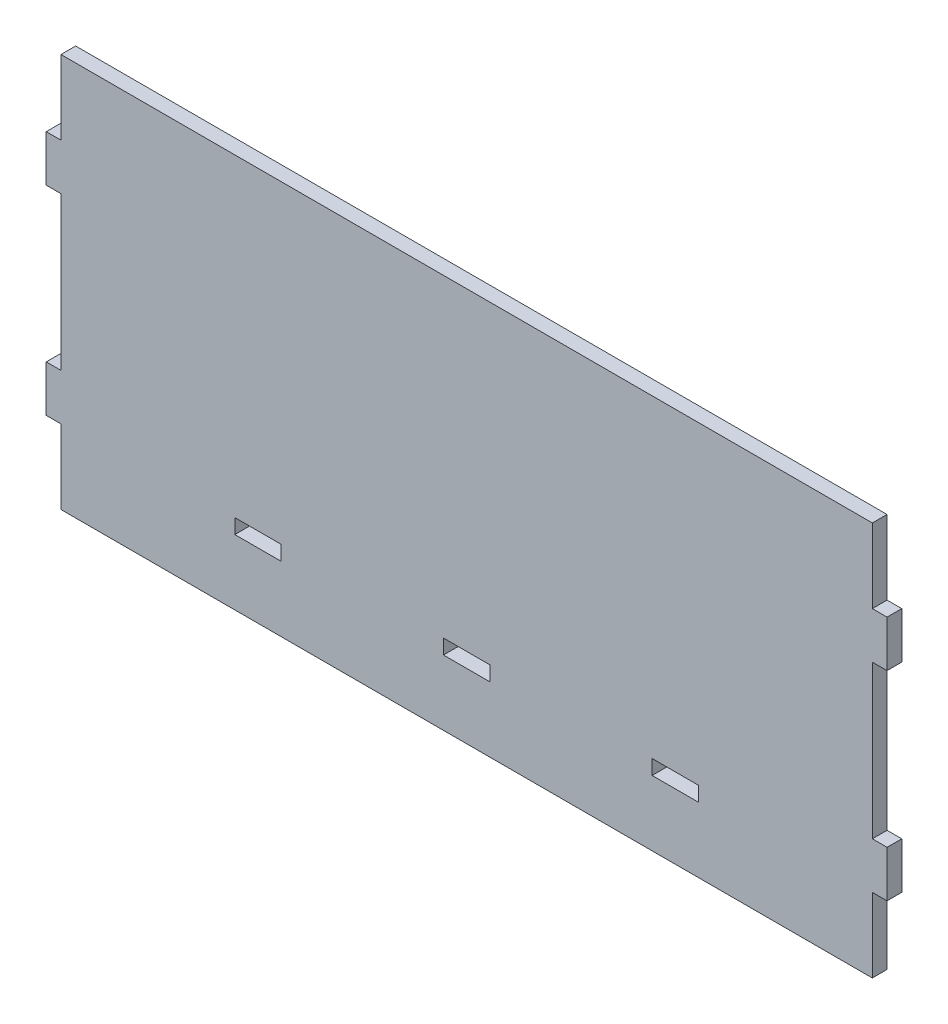
ISO-10303-21;
HEADER;
FILE_DESCRIPTION(('STEP AP214'),'2;1');
FILE_NAME('part.step','',(''),(''),'','','');
FILE_SCHEMA(('AUTOMOTIVE_DESIGN { 1 0 10303 214 1 1 1 1 }'));
ENDSEC;
DATA;
#1=APPLICATION_CONTEXT('core data for automotive mechanical design processes');
#2=APPLICATION_PROTOCOL_DEFINITION('international standard','automotive_design',2000,#1);
#3=PRODUCT_CONTEXT('',#1,'mechanical');
#4=PRODUCT('Part','Part','',(#3));
#5=PRODUCT_RELATED_PRODUCT_CATEGORY('part','',(#4));
#6=PRODUCT_DEFINITION_FORMATION('','',#4);
#7=PRODUCT_DEFINITION_CONTEXT('part definition',#1,'design');
#8=PRODUCT_DEFINITION('design','',#6,#7);
#9=PRODUCT_DEFINITION_SHAPE('','',#8);
#10=(LENGTH_UNIT() NAMED_UNIT(*) SI_UNIT(.MILLI.,.METRE.));
#11=(NAMED_UNIT(*) PLANE_ANGLE_UNIT() SI_UNIT($,.RADIAN.));
#12=(NAMED_UNIT(*) SI_UNIT($,.STERADIAN.) SOLID_ANGLE_UNIT());
#13=UNCERTAINTY_MEASURE_WITH_UNIT(LENGTH_MEASURE(1.E-05),#10,'distance_accuracy_value','');
#14=(GEOMETRIC_REPRESENTATION_CONTEXT(3) GLOBAL_UNCERTAINTY_ASSIGNED_CONTEXT((#13)) GLOBAL_UNIT_ASSIGNED_CONTEXT((#10,
#11,#12)) REPRESENTATION_CONTEXT('',''));
#15=CARTESIAN_POINT('',(0.,0.,0.));
#16=DIRECTION('',(0.,0.,1.));
#17=DIRECTION('',(1.,0.,0.));
#18=AXIS2_PLACEMENT_3D('',#15,#16,#17);
#19=CARTESIAN_POINT('',(193.650000026,150.,6.35));
#20=DIRECTION('',(-1.,0.,0.));
#21=DIRECTION('',(0.,0.,1.));
#22=AXIS2_PLACEMENT_3D('',#19,#20,#21);
#23=PLANE('',#22);
#24=DIRECTION('',(0.,1.,0.));
#25=VECTOR('',#24,1.);
#26=CARTESIAN_POINT('',(193.650000026,150.,6.35));
#27=LINE('',#26,#25);
#28=CARTESIAN_POINT('',(193.650000026,32.,6.35));
#29=VERTEX_POINT('',#28);
#30=CARTESIAN_POINT('',(193.650000026,98.,6.35));
#31=VERTEX_POINT('',#30);
#32=EDGE_CURVE('E439',#29,#31,#27,.T.);
#33=ORIENTED_EDGE('',*,*,#32,.F.);
#34=DIRECTION('',(0.,0.,-1.));
#35=VECTOR('',#34,1.);
#36=CARTESIAN_POINT('',(193.650000026,32.,0.));
#37=LINE('',#36,#35);
#38=CARTESIAN_POINT('',(193.650000026,32.,0.));
#39=VERTEX_POINT('',#38);
#40=EDGE_CURVE('E309',#29,#39,#37,.T.);
#41=ORIENTED_EDGE('',*,*,#40,.T.);
#42=DIRECTION('',(0.,1.,0.));
#43=VECTOR('',#42,1.);
#44=CARTESIAN_POINT('',(193.650000026,150.,0.));
#45=LINE('',#44,#43);
#46=CARTESIAN_POINT('',(193.650000026,98.,0.));
#47=VERTEX_POINT('',#46);
#48=EDGE_CURVE('E451',#39,#47,#45,.T.);
#49=ORIENTED_EDGE('',*,*,#48,.T.);
#50=DIRECTION('',(0.,0.,1.));
#51=VECTOR('',#50,1.);
#52=CARTESIAN_POINT('',(193.650000026,98.,0.));
#53=LINE('',#52,#51);
#54=EDGE_CURVE('E349',#47,#31,#53,.T.);
#55=ORIENTED_EDGE('',*,*,#54,.T.);
#56=EDGE_LOOP('',(#33,#41,#49,#55));
#57=FACE_BOUND('',#56,.T.);
#58=ADVANCED_FACE('F35',(#57),#23,.F.);
#59=CARTESIAN_POINT('',(193.650000026,-20.,0.));
#60=VERTEX_POINT('',#59);
#61=CARTESIAN_POINT('',(193.650000026,12.,0.));
#62=VERTEX_POINT('',#61);
#63=EDGE_CURVE('E448',#60,#62,#45,.T.);
#64=ORIENTED_EDGE('',*,*,#63,.T.);
#65=DIRECTION('',(0.,0.,1.));
#66=VECTOR('',#65,1.);
#67=CARTESIAN_POINT('',(193.650000026,12.,0.));
#68=LINE('',#67,#66);
#69=CARTESIAN_POINT('',(193.650000026,12.,6.35));
#70=VERTEX_POINT('',#69);
#71=EDGE_CURVE('E320',#62,#70,#68,.T.);
#72=ORIENTED_EDGE('',*,*,#71,.T.);
#73=CARTESIAN_POINT('',(193.650000026,-20.,6.35));
#74=VERTEX_POINT('',#73);
#75=EDGE_CURVE('E435',#74,#70,#27,.T.);
#76=ORIENTED_EDGE('',*,*,#75,.F.);
#77=DIRECTION('',(0.,0.,-1.));
#78=VECTOR('',#77,1.);
#79=CARTESIAN_POINT('',(193.650000026,-20.,6.35));
#80=LINE('',#79,#78);
#81=EDGE_CURVE('E458',#74,#60,#80,.T.);
#82=ORIENTED_EDGE('',*,*,#81,.T.);
#83=EDGE_LOOP('',(#64,#72,#76,#82));
#84=FACE_BOUND('',#83,.T.);
#85=ADVANCED_FACE('F519',(#84),#23,.F.);
#86=CARTESIAN_POINT('',(-156.349999974,150.,6.35));
#87=DIRECTION('',(1.,0.,0.));
#88=DIRECTION('',(0.,0.,-1.));
#89=AXIS2_PLACEMENT_3D('',#86,#87,#88);
#90=PLANE('',#89);
#91=DIRECTION('',(0.,0.,1.));
#92=VECTOR('',#91,1.);
#93=CARTESIAN_POINT('',(-156.349999974,12.,0.));
#94=LINE('',#93,#92);
#95=CARTESIAN_POINT('',(-156.349999974,12.,0.));
#96=VERTEX_POINT('',#95);
#97=CARTESIAN_POINT('',(-156.349999974,12.,6.35));
#98=VERTEX_POINT('',#97);
#99=EDGE_CURVE('E372',#96,#98,#94,.T.);
#100=ORIENTED_EDGE('',*,*,#99,.F.);
#101=DIRECTION('',(0.,-1.,0.));
#102=VECTOR('',#101,1.);
#103=CARTESIAN_POINT('',(-156.349999974,150.,0.));
#104=LINE('',#103,#102);
#105=CARTESIAN_POINT('',(-156.349999974,-20.,0.));
#106=VERTEX_POINT('',#105);
#107=EDGE_CURVE('E426',#96,#106,#104,.T.);
#108=ORIENTED_EDGE('',*,*,#107,.T.);
#109=DIRECTION('',(0.,0.,-1.));
#110=VECTOR('',#109,1.);
#111=CARTESIAN_POINT('',(-156.349999974,-20.,6.35));
#112=LINE('',#111,#110);
#113=CARTESIAN_POINT('',(-156.349999974,-20.,6.35));
#114=VERTEX_POINT('',#113);
#115=EDGE_CURVE('E461',#114,#106,#112,.T.);
#116=ORIENTED_EDGE('',*,*,#115,.F.);
#117=DIRECTION('',(0.,-1.,0.));
#118=VECTOR('',#117,1.);
#119=CARTESIAN_POINT('',(-156.349999974,150.,6.35));
#120=LINE('',#119,#118);
#121=EDGE_CURVE('E432',#98,#114,#120,.T.);
#122=ORIENTED_EDGE('',*,*,#121,.F.);
#123=EDGE_LOOP('',(#100,#108,#116,#122));
#124=FACE_BOUND('',#123,.T.);
#125=ADVANCED_FACE('F526',(#124),#90,.F.);
#126=DIRECTION('',(0.,0.,-1.));
#127=VECTOR('',#126,1.);
#128=CARTESIAN_POINT('',(-156.349999974,32.,0.));
#129=LINE('',#128,#127);
#130=CARTESIAN_POINT('',(-156.349999974,32.,6.35));
#131=VERTEX_POINT('',#130);
#132=CARTESIAN_POINT('',(-156.349999974,32.,0.));
#133=VERTEX_POINT('',#132);
#134=EDGE_CURVE('E377',#131,#133,#129,.T.);
#135=ORIENTED_EDGE('',*,*,#134,.F.);
#136=CARTESIAN_POINT('',(-156.349999974,98.,6.35));
#137=VERTEX_POINT('',#136);
#138=EDGE_CURVE('E431',#137,#131,#120,.T.);
#139=ORIENTED_EDGE('',*,*,#138,.F.);
#140=DIRECTION('',(0.,0.,1.));
#141=VECTOR('',#140,1.);
#142=CARTESIAN_POINT('',(-156.349999974,98.,0.));
#143=LINE('',#142,#141);
#144=CARTESIAN_POINT('',(-156.349999974,98.,0.));
#145=VERTEX_POINT('',#144);
#146=EDGE_CURVE('E399',#145,#137,#143,.T.);
#147=ORIENTED_EDGE('',*,*,#146,.F.);
#148=EDGE_CURVE('E445',#145,#133,#104,.T.);
#149=ORIENTED_EDGE('',*,*,#148,.T.);
#150=EDGE_LOOP('',(#135,#139,#147,#149));
#151=FACE_BOUND('',#150,.T.);
#152=ADVANCED_FACE('F741',(#151),#90,.F.);
#153=DIRECTION('',(0.,0.,-1.));
#154=VECTOR('',#153,1.);
#155=CARTESIAN_POINT('',(-156.349999974,118.,0.));
#156=LINE('',#155,#154);
#157=CARTESIAN_POINT('',(-156.349999974,118.,6.35));
#158=VERTEX_POINT('',#157);
#159=CARTESIAN_POINT('',(-156.349999974,118.,0.));
#160=VERTEX_POINT('',#159);
#161=EDGE_CURVE('E404',#158,#160,#156,.T.);
#162=ORIENTED_EDGE('',*,*,#161,.F.);
#163=CARTESIAN_POINT('',(-156.349999974,150.,6.35));
#164=VERTEX_POINT('',#163);
#165=EDGE_CURVE('E427',#164,#158,#120,.T.);
#166=ORIENTED_EDGE('',*,*,#165,.F.);
#167=DIRECTION('',(0.,0.,-1.));
#168=VECTOR('',#167,1.);
#169=CARTESIAN_POINT('',(-156.349999974,150.,6.35));
#170=LINE('',#169,#168);
#171=CARTESIAN_POINT('',(-156.349999974,150.,0.));
#172=VERTEX_POINT('',#171);
#173=EDGE_CURVE('E441',#164,#172,#170,.T.);
#174=ORIENTED_EDGE('',*,*,#173,.T.);
#175=EDGE_CURVE('E442',#172,#160,#104,.T.);
#176=ORIENTED_EDGE('',*,*,#175,.T.);
#177=EDGE_LOOP('',(#162,#166,#174,#176));
#178=FACE_BOUND('',#177,.T.);
#179=ADVANCED_FACE('F37',(#178),#90,.F.);
#180=CARTESIAN_POINT('',(-156.349999974,-20.,6.35));
#181=DIRECTION('',(0.,1.,0.));
#182=DIRECTION('',(-1.,0.,0.));
#183=AXIS2_PLACEMENT_3D('',#180,#181,#182);
#184=PLANE('',#183);
#185=DIRECTION('',(1.,0.,0.));
#186=VECTOR('',#185,1.);
#187=CARTESIAN_POINT('',(-156.349999974,-20.,0.));
#188=LINE('',#187,#186);
#189=EDGE_CURVE('E444',#106,#60,#188,.T.);
#190=ORIENTED_EDGE('',*,*,#189,.T.);
#191=ORIENTED_EDGE('',*,*,#81,.F.);
#192=DIRECTION('',(1.,0.,0.));
#193=VECTOR('',#192,1.);
#194=CARTESIAN_POINT('',(-156.349999974,-20.,6.35));
#195=LINE('',#194,#193);
#196=EDGE_CURVE('E430',#114,#74,#195,.T.);
#197=ORIENTED_EDGE('',*,*,#196,.F.);
#198=ORIENTED_EDGE('',*,*,#115,.T.);
#199=EDGE_LOOP('',(#190,#191,#197,#198));
#200=FACE_BOUND('',#199,.T.);
#201=ADVANCED_FACE('F531',(#200),#184,.F.);
#202=CARTESIAN_POINT('',(193.650000026,118.,6.35));
#203=VERTEX_POINT('',#202);
#204=CARTESIAN_POINT('',(193.650000026,150.,6.35));
#205=VERTEX_POINT('',#204);
#206=EDGE_CURVE('E434',#203,#205,#27,.T.);
#207=ORIENTED_EDGE('',*,*,#206,.F.);
#208=DIRECTION('',(0.,0.,-1.));
#209=VECTOR('',#208,1.);
#210=CARTESIAN_POINT('',(193.650000026,118.,0.));
#211=LINE('',#210,#209);
#212=CARTESIAN_POINT('',(193.650000026,118.,0.));
#213=VERTEX_POINT('',#212);
#214=EDGE_CURVE('E344',#203,#213,#211,.T.);
#215=ORIENTED_EDGE('',*,*,#214,.T.);
#216=CARTESIAN_POINT('',(193.650000026,150.,0.));
#217=VERTEX_POINT('',#216);
#218=EDGE_CURVE('E447',#213,#217,#45,.T.);
#219=ORIENTED_EDGE('',*,*,#218,.T.);
#220=DIRECTION('',(0.,0.,-1.));
#221=VECTOR('',#220,1.);
#222=CARTESIAN_POINT('',(193.650000026,150.,6.35));
#223=LINE('',#222,#221);
#224=EDGE_CURVE('E455',#205,#217,#223,.T.);
#225=ORIENTED_EDGE('',*,*,#224,.F.);
#226=EDGE_LOOP('',(#207,#215,#219,#225));
#227=FACE_BOUND('',#226,.T.);
#228=ADVANCED_FACE('F522',(#227),#23,.F.);
#229=CARTESIAN_POINT('',(-156.349999974,150.,6.35));
#230=DIRECTION('',(0.,-1.,0.));
#231=DIRECTION('',(0.,0.,-1.));
#232=AXIS2_PLACEMENT_3D('',#229,#230,#231);
#233=PLANE('',#232);
#234=DIRECTION('',(-1.,0.,0.));
#235=VECTOR('',#234,1.);
#236=CARTESIAN_POINT('',(-156.349999974,150.,0.));
#237=LINE('',#236,#235);
#238=EDGE_CURVE('E450',#217,#172,#237,.T.);
#239=ORIENTED_EDGE('',*,*,#238,.T.);
#240=ORIENTED_EDGE('',*,*,#173,.F.);
#241=DIRECTION('',(-1.,0.,0.));
#242=VECTOR('',#241,1.);
#243=CARTESIAN_POINT('',(-156.349999974,150.,6.35));
#244=LINE('',#243,#242);
#245=EDGE_CURVE('E438',#205,#164,#244,.T.);
#246=ORIENTED_EDGE('',*,*,#245,.F.);
#247=ORIENTED_EDGE('',*,*,#224,.T.);
#248=EDGE_LOOP('',(#239,#240,#246,#247));
#249=FACE_BOUND('',#248,.T.);
#250=ADVANCED_FACE('F530',(#249),#233,.F.);
#251=CARTESIAN_POINT('',(0.,0.,6.35));
#252=DIRECTION('',(0.,0.,1.));
#253=DIRECTION('',(1.,0.,0.));
#254=AXIS2_PLACEMENT_3D('',#251,#252,#253);
#255=PLANE('',#254);
#256=DIRECTION('',(0.,1.,0.));
#257=VECTOR('',#256,1.);
#258=CARTESIAN_POINT('',(-61.349999974,8.15999999999937,6.35));
#259=LINE('',#258,#257);
#260=CARTESIAN_POINT('',(-61.349999974,8.15999999999937,6.35));
#261=VERTEX_POINT('',#260);
#262=CARTESIAN_POINT('',(-61.349999974,14.5099999999994,6.35));
#263=VERTEX_POINT('',#262);
#264=EDGE_CURVE('E50',#261,#263,#259,.T.);
#265=ORIENTED_EDGE('',*,*,#264,.F.);
#266=DIRECTION('',(1.,0.,0.));
#267=VECTOR('',#266,1.);
#268=CARTESIAN_POINT('',(-61.349999974,8.15999999999937,6.35));
#269=LINE('',#268,#267);
#270=CARTESIAN_POINT('',(-81.3499999740001,8.15999999999937,6.35));
#271=VERTEX_POINT('',#270);
#272=EDGE_CURVE('E285',#271,#261,#269,.T.);
#273=ORIENTED_EDGE('',*,*,#272,.F.);
#274=DIRECTION('',(0.,-1.,0.));
#275=VECTOR('',#274,1.);
#276=CARTESIAN_POINT('',(-81.3499999740001,8.15999999999937,6.35));
#277=LINE('',#276,#275);
#278=CARTESIAN_POINT('',(-81.3499999740001,14.5099999999994,6.35));
#279=VERTEX_POINT('',#278);
#280=EDGE_CURVE('E282',#279,#271,#277,.T.);
#281=ORIENTED_EDGE('',*,*,#280,.F.);
#282=DIRECTION('',(-1.,0.,0.));
#283=VECTOR('',#282,1.);
#284=CARTESIAN_POINT('',(-61.349999974,14.5099999999994,6.35));
#285=LINE('',#284,#283);
#286=EDGE_CURVE('E279',#263,#279,#285,.T.);
#287=ORIENTED_EDGE('',*,*,#286,.F.);
#288=EDGE_LOOP('',(#265,#273,#281,#287));
#289=FACE_BOUND('',#288,.T.);
#290=DIRECTION('',(0.,1.,0.));
#291=VECTOR('',#290,1.);
#292=CARTESIAN_POINT('',(118.650000026,8.16,6.35));
#293=LINE('',#292,#291);
#294=CARTESIAN_POINT('',(118.650000026,8.16,6.35));
#295=VERTEX_POINT('',#294);
#296=CARTESIAN_POINT('',(118.650000026,14.51,6.35));
#297=VERTEX_POINT('',#296);
#298=EDGE_CURVE('E58',#295,#297,#293,.T.);
#299=ORIENTED_EDGE('',*,*,#298,.F.);
#300=DIRECTION('',(1.,0.,0.));
#301=VECTOR('',#300,1.);
#302=CARTESIAN_POINT('',(118.650000026,8.16,6.35));
#303=LINE('',#302,#301);
#304=CARTESIAN_POINT('',(98.6500000259999,8.16,6.35));
#305=VERTEX_POINT('',#304);
#306=EDGE_CURVE('E268',#305,#295,#303,.T.);
#307=ORIENTED_EDGE('',*,*,#306,.F.);
#308=DIRECTION('',(0.,-1.,0.));
#309=VECTOR('',#308,1.);
#310=CARTESIAN_POINT('',(98.6500000259999,8.16,6.35));
#311=LINE('',#310,#309);
#312=CARTESIAN_POINT('',(98.6500000259999,14.51,6.35));
#313=VERTEX_POINT('',#312);
#314=EDGE_CURVE('E251',#313,#305,#311,.T.);
#315=ORIENTED_EDGE('',*,*,#314,.F.);
#316=DIRECTION('',(-1.,0.,0.));
#317=VECTOR('',#316,1.);
#318=CARTESIAN_POINT('',(118.650000026,14.51,6.35));
#319=LINE('',#318,#317);
#320=EDGE_CURVE('E261',#297,#313,#319,.T.);
#321=ORIENTED_EDGE('',*,*,#320,.F.);
#322=EDGE_LOOP('',(#299,#307,#315,#321));
#323=FACE_BOUND('',#322,.T.);
#324=DIRECTION('',(0.,1.,0.));
#325=VECTOR('',#324,1.);
#326=CARTESIAN_POINT('',(28.650000026,8.16,6.35));
#327=LINE('',#326,#325);
#328=CARTESIAN_POINT('',(28.650000026,8.16,6.35));
#329=VERTEX_POINT('',#328);
#330=CARTESIAN_POINT('',(28.650000026,14.51,6.35));
#331=VERTEX_POINT('',#330);
#332=EDGE_CURVE('E275',#329,#331,#327,.T.);
#333=ORIENTED_EDGE('',*,*,#332,.F.);
#334=DIRECTION('',(1.,0.,0.));
#335=VECTOR('',#334,1.);
#336=CARTESIAN_POINT('',(28.650000026,8.16,6.35));
#337=LINE('',#336,#335);
#338=CARTESIAN_POINT('',(8.65000002599995,8.16,6.35));
#339=VERTEX_POINT('',#338);
#340=EDGE_CURVE('E303',#339,#329,#337,.T.);
#341=ORIENTED_EDGE('',*,*,#340,.F.);
#342=DIRECTION('',(0.,-1.,0.));
#343=VECTOR('',#342,1.);
#344=CARTESIAN_POINT('',(8.65000002599995,8.16,6.35));
#345=LINE('',#344,#343);
#346=CARTESIAN_POINT('',(8.65000002599995,14.51,6.35));
#347=VERTEX_POINT('',#346);
#348=EDGE_CURVE('E300',#347,#339,#345,.T.);
#349=ORIENTED_EDGE('',*,*,#348,.F.);
#350=DIRECTION('',(-1.,0.,0.));
#351=VECTOR('',#350,1.);
#352=CARTESIAN_POINT('',(28.650000026,14.51,6.35));
#353=LINE('',#352,#351);
#354=EDGE_CURVE('E297',#331,#347,#353,.T.);
#355=ORIENTED_EDGE('',*,*,#354,.F.);
#356=EDGE_LOOP('',(#333,#341,#349,#355));
#357=FACE_BOUND('',#356,.T.);
#358=ORIENTED_EDGE('',*,*,#165,.T.);
#359=DIRECTION('',(1.,0.,0.));
#360=VECTOR('',#359,1.);
#361=CARTESIAN_POINT('',(-162.699999974,118.,6.35));
#362=LINE('',#361,#360);
#363=CARTESIAN_POINT('',(-162.699999974,118.,6.35));
#364=VERTEX_POINT('',#363);
#365=EDGE_CURVE('E417',#364,#158,#362,.T.);
#366=ORIENTED_EDGE('',*,*,#365,.F.);
#367=DIRECTION('',(0.,1.,0.));
#368=VECTOR('',#367,1.);
#369=CARTESIAN_POINT('',(-162.699999974,118.,6.35));
#370=LINE('',#369,#368);
#371=CARTESIAN_POINT('',(-162.699999974,98.,6.35));
#372=VERTEX_POINT('',#371);
#373=EDGE_CURVE('E406',#372,#364,#370,.T.);
#374=ORIENTED_EDGE('',*,*,#373,.F.);
#375=DIRECTION('',(1.,0.,0.));
#376=VECTOR('',#375,1.);
#377=CARTESIAN_POINT('',(-162.699999974,98.,6.35));
#378=LINE('',#377,#376);
#379=EDGE_CURVE('E420',#372,#137,#378,.T.);
#380=ORIENTED_EDGE('',*,*,#379,.T.);
#381=ORIENTED_EDGE('',*,*,#138,.T.);
#382=DIRECTION('',(1.,0.,0.));
#383=VECTOR('',#382,1.);
#384=CARTESIAN_POINT('',(-162.699999974,32.,6.35));
#385=LINE('',#384,#383);
#386=CARTESIAN_POINT('',(-162.699999974,32.,6.35));
#387=VERTEX_POINT('',#386);
#388=EDGE_CURVE('E390',#387,#131,#385,.T.);
#389=ORIENTED_EDGE('',*,*,#388,.F.);
#390=DIRECTION('',(0.,1.,0.));
#391=VECTOR('',#390,1.);
#392=CARTESIAN_POINT('',(-162.699999974,32.,6.35));
#393=LINE('',#392,#391);
#394=CARTESIAN_POINT('',(-162.699999974,12.,6.35));
#395=VERTEX_POINT('',#394);
#396=EDGE_CURVE('E379',#395,#387,#393,.T.);
#397=ORIENTED_EDGE('',*,*,#396,.F.);
#398=DIRECTION('',(1.,0.,0.));
#399=VECTOR('',#398,1.);
#400=CARTESIAN_POINT('',(-162.699999974,12.,6.35));
#401=LINE('',#400,#399);
#402=EDGE_CURVE('E393',#395,#98,#401,.T.);
#403=ORIENTED_EDGE('',*,*,#402,.T.);
#404=ORIENTED_EDGE('',*,*,#121,.T.);
#405=ORIENTED_EDGE('',*,*,#196,.T.);
#406=ORIENTED_EDGE('',*,*,#75,.T.);
#407=DIRECTION('',(-1.,0.,0.));
#408=VECTOR('',#407,1.);
#409=CARTESIAN_POINT('',(200.000000026,12.,6.35));
#410=LINE('',#409,#408);
#411=CARTESIAN_POINT('',(200.000000026,12.,6.35));
#412=VERTEX_POINT('',#411);
#413=EDGE_CURVE('E335',#412,#70,#410,.T.);
#414=ORIENTED_EDGE('',*,*,#413,.F.);
#415=DIRECTION('',(0.,1.,0.));
#416=VECTOR('',#415,1.);
#417=CARTESIAN_POINT('',(200.000000026,32.,6.35));
#418=LINE('',#417,#416);
#419=CARTESIAN_POINT('',(200.000000026,32.,6.35));
#420=VERTEX_POINT('',#419);
#421=EDGE_CURVE('E323',#412,#420,#418,.T.);
#422=ORIENTED_EDGE('',*,*,#421,.T.);
#423=DIRECTION('',(-1.,0.,0.));
#424=VECTOR('',#423,1.);
#425=CARTESIAN_POINT('',(200.000000026,32.,6.35));
#426=LINE('',#425,#424);
#427=EDGE_CURVE('E338',#420,#29,#426,.T.);
#428=ORIENTED_EDGE('',*,*,#427,.T.);
#429=ORIENTED_EDGE('',*,*,#32,.T.);
#430=DIRECTION('',(-1.,0.,0.));
#431=VECTOR('',#430,1.);
#432=CARTESIAN_POINT('',(200.000000026,98.,6.35));
#433=LINE('',#432,#431);
#434=CARTESIAN_POINT('',(200.000000026,98.,6.35));
#435=VERTEX_POINT('',#434);
#436=EDGE_CURVE('E365',#435,#31,#433,.T.);
#437=ORIENTED_EDGE('',*,*,#436,.F.);
#438=DIRECTION('',(0.,1.,0.));
#439=VECTOR('',#438,1.);
#440=CARTESIAN_POINT('',(200.000000026,118.,6.35));
#441=LINE('',#440,#439);
#442=CARTESIAN_POINT('',(200.000000026,118.,6.35));
#443=VERTEX_POINT('',#442);
#444=EDGE_CURVE('E352',#435,#443,#441,.T.);
#445=ORIENTED_EDGE('',*,*,#444,.T.);
#446=DIRECTION('',(-1.,0.,0.));
#447=VECTOR('',#446,1.);
#448=CARTESIAN_POINT('',(200.000000026,118.,6.35));
#449=LINE('',#448,#447);
#450=EDGE_CURVE('E368',#443,#203,#449,.T.);
#451=ORIENTED_EDGE('',*,*,#450,.T.);
#452=ORIENTED_EDGE('',*,*,#206,.T.);
#453=ORIENTED_EDGE('',*,*,#245,.T.);
#454=EDGE_LOOP('',(#358,#366,#374,#380,#381,#389,#397,#403,#404,#405,#406,#414,#422,#428,#429,
#437,#445,#451,#452,#453));
#455=FACE_BOUND('',#454,.T.);
#456=ADVANCED_FACE('F265',(#289,#323,#357,#455),#255,.T.);
#457=CARTESIAN_POINT('',(0.,0.,0.));
#458=DIRECTION('',(0.,0.,1.));
#459=DIRECTION('',(1.,0.,0.));
#460=AXIS2_PLACEMENT_3D('',#457,#458,#459);
#461=PLANE('',#460);
#462=DIRECTION('',(1.,0.,0.));
#463=VECTOR('',#462,1.);
#464=CARTESIAN_POINT('',(0.,8.15999999999939,0.));
#465=LINE('',#464,#463);
#466=CARTESIAN_POINT('',(-81.3499999740001,8.15999999999937,0.));
#467=VERTEX_POINT('',#466);
#468=CARTESIAN_POINT('',(-61.349999974,8.15999999999937,0.));
#469=VERTEX_POINT('',#468);
#470=EDGE_CURVE('E43',#467,#469,#465,.T.);
#471=ORIENTED_EDGE('',*,*,#470,.T.);
#472=DIRECTION('',(0.,1.,0.));
#473=VECTOR('',#472,1.);
#474=CARTESIAN_POINT('',(-61.349999974,0.,0.));
#475=LINE('',#474,#473);
#476=CARTESIAN_POINT('',(-61.349999974,14.5099999999994,0.));
#477=VERTEX_POINT('',#476);
#478=EDGE_CURVE('E11',#469,#477,#475,.T.);
#479=ORIENTED_EDGE('',*,*,#478,.T.);
#480=DIRECTION('',(-1.,0.,0.));
#481=VECTOR('',#480,1.);
#482=CARTESIAN_POINT('',(0.,14.5099999999994,0.));
#483=LINE('',#482,#481);
#484=CARTESIAN_POINT('',(-81.3499999740001,14.5099999999994,0.));
#485=VERTEX_POINT('',#484);
#486=EDGE_CURVE('E485',#477,#485,#483,.T.);
#487=ORIENTED_EDGE('',*,*,#486,.T.);
#488=DIRECTION('',(0.,-1.,0.));
#489=VECTOR('',#488,1.);
#490=CARTESIAN_POINT('',(-81.3499999740001,0.,0.));
#491=LINE('',#490,#489);
#492=EDGE_CURVE('E488',#485,#467,#491,.T.);
#493=ORIENTED_EDGE('',*,*,#492,.T.);
#494=EDGE_LOOP('',(#471,#479,#487,#493));
#495=FACE_BOUND('',#494,.T.);
#496=DIRECTION('',(1.,0.,0.));
#497=VECTOR('',#496,1.);
#498=CARTESIAN_POINT('',(0.,8.15999999999997,0.));
#499=LINE('',#498,#497);
#500=CARTESIAN_POINT('',(98.6500000259999,8.16,0.));
#501=VERTEX_POINT('',#500);
#502=CARTESIAN_POINT('',(118.650000026,8.16,0.));
#503=VERTEX_POINT('',#502);
#504=EDGE_CURVE('E479',#501,#503,#499,.T.);
#505=ORIENTED_EDGE('',*,*,#504,.T.);
#506=DIRECTION('',(0.,1.,0.));
#507=VECTOR('',#506,1.);
#508=CARTESIAN_POINT('',(118.650000026,0.,0.));
#509=LINE('',#508,#507);
#510=CARTESIAN_POINT('',(118.650000026,14.51,0.));
#511=VERTEX_POINT('',#510);
#512=EDGE_CURVE('E482',#503,#511,#509,.T.);
#513=ORIENTED_EDGE('',*,*,#512,.T.);
#514=DIRECTION('',(-1.,0.,0.));
#515=VECTOR('',#514,1.);
#516=CARTESIAN_POINT('',(0.,14.51,0.));
#517=LINE('',#516,#515);
#518=CARTESIAN_POINT('',(98.6500000259999,14.51,0.));
#519=VERTEX_POINT('',#518);
#520=EDGE_CURVE('E476',#511,#519,#517,.T.);
#521=ORIENTED_EDGE('',*,*,#520,.T.);
#522=DIRECTION('',(0.,-1.,0.));
#523=VECTOR('',#522,1.);
#524=CARTESIAN_POINT('',(98.6500000259999,0.,0.));
#525=LINE('',#524,#523);
#526=EDGE_CURVE('E254',#519,#501,#525,.T.);
#527=ORIENTED_EDGE('',*,*,#526,.T.);
#528=EDGE_LOOP('',(#505,#513,#521,#527));
#529=FACE_BOUND('',#528,.T.);
#530=DIRECTION('',(1.,0.,0.));
#531=VECTOR('',#530,1.);
#532=CARTESIAN_POINT('',(0.,8.15999999999999,0.));
#533=LINE('',#532,#531);
#534=CARTESIAN_POINT('',(8.65000002599995,8.16,0.));
#535=VERTEX_POINT('',#534);
#536=CARTESIAN_POINT('',(28.650000026,8.16,0.));
#537=VERTEX_POINT('',#536);
#538=EDGE_CURVE('E470',#535,#537,#533,.T.);
#539=ORIENTED_EDGE('',*,*,#538,.T.);
#540=DIRECTION('',(0.,1.,0.));
#541=VECTOR('',#540,1.);
#542=CARTESIAN_POINT('',(28.650000026,0.,0.));
#543=LINE('',#542,#541);
#544=CARTESIAN_POINT('',(28.650000026,14.51,0.));
#545=VERTEX_POINT('',#544);
#546=EDGE_CURVE('E473',#537,#545,#543,.T.);
#547=ORIENTED_EDGE('',*,*,#546,.T.);
#548=DIRECTION('',(-1.,0.,0.));
#549=VECTOR('',#548,1.);
#550=CARTESIAN_POINT('',(0.,14.51,0.));
#551=LINE('',#550,#549);
#552=CARTESIAN_POINT('',(8.65000002599995,14.51,0.));
#553=VERTEX_POINT('',#552);
#554=EDGE_CURVE('E464',#545,#553,#551,.T.);
#555=ORIENTED_EDGE('',*,*,#554,.T.);
#556=DIRECTION('',(0.,-1.,0.));
#557=VECTOR('',#556,1.);
#558=CARTESIAN_POINT('',(8.65000002599995,0.,0.));
#559=LINE('',#558,#557);
#560=EDGE_CURVE('E467',#553,#535,#559,.T.);
#561=ORIENTED_EDGE('',*,*,#560,.T.);
#562=EDGE_LOOP('',(#539,#547,#555,#561));
#563=FACE_BOUND('',#562,.T.);
#564=ORIENTED_EDGE('',*,*,#175,.F.);
#565=ORIENTED_EDGE('',*,*,#238,.F.);
#566=ORIENTED_EDGE('',*,*,#218,.F.);
#567=DIRECTION('',(-1.,0.,0.));
#568=VECTOR('',#567,1.);
#569=CARTESIAN_POINT('',(200.000000026,118.,0.));
#570=LINE('',#569,#568);
#571=CARTESIAN_POINT('',(200.000000026,118.,0.));
#572=VERTEX_POINT('',#571);
#573=EDGE_CURVE('E370',#572,#213,#570,.T.);
#574=ORIENTED_EDGE('',*,*,#573,.F.);
#575=DIRECTION('',(0.,-1.,0.));
#576=VECTOR('',#575,1.);
#577=CARTESIAN_POINT('',(200.000000026,118.,0.));
#578=LINE('',#577,#576);
#579=CARTESIAN_POINT('',(200.000000026,98.,0.));
#580=VERTEX_POINT('',#579);
#581=EDGE_CURVE('E345',#572,#580,#578,.T.);
#582=ORIENTED_EDGE('',*,*,#581,.T.);
#583=DIRECTION('',(-1.,0.,0.));
#584=VECTOR('',#583,1.);
#585=CARTESIAN_POINT('',(200.000000026,98.,0.));
#586=LINE('',#585,#584);
#587=EDGE_CURVE('E358',#580,#47,#586,.T.);
#588=ORIENTED_EDGE('',*,*,#587,.T.);
#589=ORIENTED_EDGE('',*,*,#48,.F.);
#590=DIRECTION('',(-1.,0.,0.));
#591=VECTOR('',#590,1.);
#592=CARTESIAN_POINT('',(200.000000026,32.,0.));
#593=LINE('',#592,#591);
#594=CARTESIAN_POINT('',(200.000000026,32.,0.));
#595=VERTEX_POINT('',#594);
#596=EDGE_CURVE('E341',#595,#39,#593,.T.);
#597=ORIENTED_EDGE('',*,*,#596,.F.);
#598=DIRECTION('',(0.,-1.,0.));
#599=VECTOR('',#598,1.);
#600=CARTESIAN_POINT('',(200.000000026,32.,0.));
#601=LINE('',#600,#599);
#602=CARTESIAN_POINT('',(200.000000026,12.,0.));
#603=VERTEX_POINT('',#602);
#604=EDGE_CURVE('E316',#595,#603,#601,.T.);
#605=ORIENTED_EDGE('',*,*,#604,.T.);
#606=DIRECTION('',(-1.,0.,0.));
#607=VECTOR('',#606,1.);
#608=CARTESIAN_POINT('',(200.000000026,12.,0.));
#609=LINE('',#608,#607);
#610=EDGE_CURVE('E329',#603,#62,#609,.T.);
#611=ORIENTED_EDGE('',*,*,#610,.T.);
#612=ORIENTED_EDGE('',*,*,#63,.F.);
#613=ORIENTED_EDGE('',*,*,#189,.F.);
#614=ORIENTED_EDGE('',*,*,#107,.F.);
#615=DIRECTION('',(1.,0.,0.));
#616=VECTOR('',#615,1.);
#617=CARTESIAN_POINT('',(-162.699999974,12.,0.));
#618=LINE('',#617,#616);
#619=CARTESIAN_POINT('',(-162.699999974,12.,0.));
#620=VERTEX_POINT('',#619);
#621=EDGE_CURVE('E396',#620,#96,#618,.T.);
#622=ORIENTED_EDGE('',*,*,#621,.F.);
#623=DIRECTION('',(0.,-1.,0.));
#624=VECTOR('',#623,1.);
#625=CARTESIAN_POINT('',(-162.699999974,32.,0.));
#626=LINE('',#625,#624);
#627=CARTESIAN_POINT('',(-162.699999974,32.,0.));
#628=VERTEX_POINT('',#627);
#629=EDGE_CURVE('E373',#628,#620,#626,.T.);
#630=ORIENTED_EDGE('',*,*,#629,.F.);
#631=DIRECTION('',(1.,0.,0.));
#632=VECTOR('',#631,1.);
#633=CARTESIAN_POINT('',(-162.699999974,32.,0.));
#634=LINE('',#633,#632);
#635=EDGE_CURVE('E383',#628,#133,#634,.T.);
#636=ORIENTED_EDGE('',*,*,#635,.T.);
#637=ORIENTED_EDGE('',*,*,#148,.F.);
#638=DIRECTION('',(1.,0.,0.));
#639=VECTOR('',#638,1.);
#640=CARTESIAN_POINT('',(-162.699999974,98.,0.));
#641=LINE('',#640,#639);
#642=CARTESIAN_POINT('',(-162.699999974,98.,0.));
#643=VERTEX_POINT('',#642);
#644=EDGE_CURVE('E423',#643,#145,#641,.T.);
#645=ORIENTED_EDGE('',*,*,#644,.F.);
#646=DIRECTION('',(0.,-1.,0.));
#647=VECTOR('',#646,1.);
#648=CARTESIAN_POINT('',(-162.699999974,118.,0.));
#649=LINE('',#648,#647);
#650=CARTESIAN_POINT('',(-162.699999974,118.,0.));
#651=VERTEX_POINT('',#650);
#652=EDGE_CURVE('E400',#651,#643,#649,.T.);
#653=ORIENTED_EDGE('',*,*,#652,.F.);
#654=DIRECTION('',(1.,0.,0.));
#655=VECTOR('',#654,1.);
#656=CARTESIAN_POINT('',(-162.699999974,118.,0.));
#657=LINE('',#656,#655);
#658=EDGE_CURVE('E410',#651,#160,#657,.T.);
#659=ORIENTED_EDGE('',*,*,#658,.T.);
#660=EDGE_LOOP('',(#564,#565,#566,#574,#582,#588,#589,#597,#605,#611,#612,#613,#614,#622,#630,
#636,#637,#645,#653,#659));
#661=FACE_BOUND('',#660,.T.);
#662=ADVANCED_FACE('F492',(#495,#529,#563,#661),#461,.F.);
#663=CARTESIAN_POINT('',(-162.699999974,98.,0.));
#664=DIRECTION('',(0.,1.,0.));
#665=DIRECTION('',(0.,0.,1.));
#666=AXIS2_PLACEMENT_3D('',#663,#664,#665);
#667=PLANE('',#666);
#668=ORIENTED_EDGE('',*,*,#146,.T.);
#669=ORIENTED_EDGE('',*,*,#379,.F.);
#670=DIRECTION('',(0.,0.,1.));
#671=VECTOR('',#670,1.);
#672=CARTESIAN_POINT('',(-162.699999974,98.,0.));
#673=LINE('',#672,#671);
#674=EDGE_CURVE('E403',#643,#372,#673,.T.);
#675=ORIENTED_EDGE('',*,*,#674,.F.);
#676=ORIENTED_EDGE('',*,*,#644,.T.);
#677=EDGE_LOOP('',(#668,#669,#675,#676));
#678=FACE_BOUND('',#677,.T.);
#679=ADVANCED_FACE('F586',(#678),#667,.F.);
#680=CARTESIAN_POINT('',(-162.699999974,118.,0.));
#681=DIRECTION('',(0.,-1.,0.));
#682=DIRECTION('',(0.,0.,-1.));
#683=AXIS2_PLACEMENT_3D('',#680,#681,#682);
#684=PLANE('',#683);
#685=ORIENTED_EDGE('',*,*,#161,.T.);
#686=ORIENTED_EDGE('',*,*,#658,.F.);
#687=DIRECTION('',(0.,0.,-1.));
#688=VECTOR('',#687,1.);
#689=CARTESIAN_POINT('',(-162.699999974,118.,0.));
#690=LINE('',#689,#688);
#691=EDGE_CURVE('E408',#364,#651,#690,.T.);
#692=ORIENTED_EDGE('',*,*,#691,.F.);
#693=ORIENTED_EDGE('',*,*,#365,.T.);
#694=EDGE_LOOP('',(#685,#686,#692,#693));
#695=FACE_BOUND('',#694,.T.);
#696=ADVANCED_FACE('F582',(#695),#684,.F.);
#697=CARTESIAN_POINT('',(-162.699999974,0.,0.));
#698=DIRECTION('',(-1.,0.,0.));
#699=DIRECTION('',(0.,0.,1.));
#700=AXIS2_PLACEMENT_3D('',#697,#698,#699);
#701=PLANE('',#700);
#702=ORIENTED_EDGE('',*,*,#652,.T.);
#703=ORIENTED_EDGE('',*,*,#674,.T.);
#704=ORIENTED_EDGE('',*,*,#373,.T.);
#705=ORIENTED_EDGE('',*,*,#691,.T.);
#706=EDGE_LOOP('',(#702,#703,#704,#705));
#707=FACE_BOUND('',#706,.T.);
#708=ADVANCED_FACE('F578',(#707),#701,.T.);
#709=CARTESIAN_POINT('',(-162.699999974,12.,0.));
#710=DIRECTION('',(0.,1.,0.));
#711=DIRECTION('',(0.,0.,1.));
#712=AXIS2_PLACEMENT_3D('',#709,#710,#711);
#713=PLANE('',#712);
#714=ORIENTED_EDGE('',*,*,#99,.T.);
#715=ORIENTED_EDGE('',*,*,#402,.F.);
#716=DIRECTION('',(0.,0.,1.));
#717=VECTOR('',#716,1.);
#718=CARTESIAN_POINT('',(-162.699999974,12.,0.));
#719=LINE('',#718,#717);
#720=EDGE_CURVE('E376',#620,#395,#719,.T.);
#721=ORIENTED_EDGE('',*,*,#720,.F.);
#722=ORIENTED_EDGE('',*,*,#621,.T.);
#723=EDGE_LOOP('',(#714,#715,#721,#722));
#724=FACE_BOUND('',#723,.T.);
#725=ADVANCED_FACE('F574',(#724),#713,.F.);
#726=CARTESIAN_POINT('',(-162.699999974,32.,0.));
#727=DIRECTION('',(0.,-1.,0.));
#728=DIRECTION('',(0.,0.,-1.));
#729=AXIS2_PLACEMENT_3D('',#726,#727,#728);
#730=PLANE('',#729);
#731=ORIENTED_EDGE('',*,*,#134,.T.);
#732=ORIENTED_EDGE('',*,*,#635,.F.);
#733=DIRECTION('',(0.,0.,-1.));
#734=VECTOR('',#733,1.);
#735=CARTESIAN_POINT('',(-162.699999974,32.,0.));
#736=LINE('',#735,#734);
#737=EDGE_CURVE('E381',#387,#628,#736,.T.);
#738=ORIENTED_EDGE('',*,*,#737,.F.);
#739=ORIENTED_EDGE('',*,*,#388,.T.);
#740=EDGE_LOOP('',(#731,#732,#738,#739));
#741=FACE_BOUND('',#740,.T.);
#742=ADVANCED_FACE('F567',(#741),#730,.F.);
#743=CARTESIAN_POINT('',(-162.699999974,0.,0.));
#744=DIRECTION('',(-1.,0.,0.));
#745=DIRECTION('',(0.,0.,1.));
#746=AXIS2_PLACEMENT_3D('',#743,#744,#745);
#747=PLANE('',#746);
#748=ORIENTED_EDGE('',*,*,#629,.T.);
#749=ORIENTED_EDGE('',*,*,#720,.T.);
#750=ORIENTED_EDGE('',*,*,#396,.T.);
#751=ORIENTED_EDGE('',*,*,#737,.T.);
#752=EDGE_LOOP('',(#748,#749,#750,#751));
#753=FACE_BOUND('',#752,.T.);
#754=ADVANCED_FACE('F560',(#753),#747,.T.);
#755=CARTESIAN_POINT('',(200.000000026,118.,0.));
#756=DIRECTION('',(0.,1.,0.));
#757=DIRECTION('',(0.,0.,1.));
#758=AXIS2_PLACEMENT_3D('',#755,#756,#757);
#759=PLANE('',#758);
#760=ORIENTED_EDGE('',*,*,#214,.F.);
#761=ORIENTED_EDGE('',*,*,#450,.F.);
#762=DIRECTION('',(0.,0.,-1.));
#763=VECTOR('',#762,1.);
#764=CARTESIAN_POINT('',(200.000000026,118.,0.));
#765=LINE('',#764,#763);
#766=EDGE_CURVE('E348',#443,#572,#765,.T.);
#767=ORIENTED_EDGE('',*,*,#766,.T.);
#768=ORIENTED_EDGE('',*,*,#573,.T.);
#769=EDGE_LOOP('',(#760,#761,#767,#768));
#770=FACE_BOUND('',#769,.T.);
#771=ADVANCED_FACE('F558',(#770),#759,.T.);
#772=CARTESIAN_POINT('',(200.000000026,98.,0.));
#773=DIRECTION('',(0.,-1.,0.));
#774=DIRECTION('',(0.,0.,-1.));
#775=AXIS2_PLACEMENT_3D('',#772,#773,#774);
#776=PLANE('',#775);
#777=ORIENTED_EDGE('',*,*,#54,.F.);
#778=ORIENTED_EDGE('',*,*,#587,.F.);
#779=DIRECTION('',(0.,0.,1.));
#780=VECTOR('',#779,1.);
#781=CARTESIAN_POINT('',(200.000000026,98.,0.));
#782=LINE('',#781,#780);
#783=EDGE_CURVE('E355',#580,#435,#782,.T.);
#784=ORIENTED_EDGE('',*,*,#783,.T.);
#785=ORIENTED_EDGE('',*,*,#436,.T.);
#786=EDGE_LOOP('',(#777,#778,#784,#785));
#787=FACE_BOUND('',#786,.T.);
#788=ADVANCED_FACE('F549',(#787),#776,.T.);
#789=CARTESIAN_POINT('',(200.000000026,0.,0.));
#790=DIRECTION('',(1.,0.,0.));
#791=DIRECTION('',(0.,0.,1.));
#792=AXIS2_PLACEMENT_3D('',#789,#790,#791);
#793=PLANE('',#792);
#794=ORIENTED_EDGE('',*,*,#581,.F.);
#795=ORIENTED_EDGE('',*,*,#766,.F.);
#796=ORIENTED_EDGE('',*,*,#444,.F.);
#797=ORIENTED_EDGE('',*,*,#783,.F.);
#798=EDGE_LOOP('',(#794,#795,#796,#797));
#799=FACE_BOUND('',#798,.T.);
#800=ADVANCED_FACE('F556',(#799),#793,.T.);
#801=CARTESIAN_POINT('',(200.000000026,32.,0.));
#802=DIRECTION('',(0.,1.,0.));
#803=DIRECTION('',(0.,0.,1.));
#804=AXIS2_PLACEMENT_3D('',#801,#802,#803);
#805=PLANE('',#804);
#806=ORIENTED_EDGE('',*,*,#40,.F.);
#807=ORIENTED_EDGE('',*,*,#427,.F.);
#808=DIRECTION('',(0.,0.,-1.));
#809=VECTOR('',#808,1.);
#810=CARTESIAN_POINT('',(200.000000026,32.,0.));
#811=LINE('',#810,#809);
#812=EDGE_CURVE('E319',#420,#595,#811,.T.);
#813=ORIENTED_EDGE('',*,*,#812,.T.);
#814=ORIENTED_EDGE('',*,*,#596,.T.);
#815=EDGE_LOOP('',(#806,#807,#813,#814));
#816=FACE_BOUND('',#815,.T.);
#817=ADVANCED_FACE('F661',(#816),#805,.T.);
#818=CARTESIAN_POINT('',(200.000000026,12.,0.));
#819=DIRECTION('',(0.,-1.,0.));
#820=DIRECTION('',(0.,0.,-1.));
#821=AXIS2_PLACEMENT_3D('',#818,#819,#820);
#822=PLANE('',#821);
#823=ORIENTED_EDGE('',*,*,#71,.F.);
#824=ORIENTED_EDGE('',*,*,#610,.F.);
#825=DIRECTION('',(0.,0.,1.));
#826=VECTOR('',#825,1.);
#827=CARTESIAN_POINT('',(200.000000026,12.,0.));
#828=LINE('',#827,#826);
#829=EDGE_CURVE('E326',#603,#412,#828,.T.);
#830=ORIENTED_EDGE('',*,*,#829,.T.);
#831=ORIENTED_EDGE('',*,*,#413,.T.);
#832=EDGE_LOOP('',(#823,#824,#830,#831));
#833=FACE_BOUND('',#832,.T.);
#834=ADVANCED_FACE('F669',(#833),#822,.T.);
#835=CARTESIAN_POINT('',(200.000000026,0.,0.));
#836=DIRECTION('',(1.,0.,0.));
#837=DIRECTION('',(0.,0.,1.));
#838=AXIS2_PLACEMENT_3D('',#835,#836,#837);
#839=PLANE('',#838);
#840=ORIENTED_EDGE('',*,*,#604,.F.);
#841=ORIENTED_EDGE('',*,*,#812,.F.);
#842=ORIENTED_EDGE('',*,*,#421,.F.);
#843=ORIENTED_EDGE('',*,*,#829,.F.);
#844=EDGE_LOOP('',(#840,#841,#842,#843));
#845=FACE_BOUND('',#844,.T.);
#846=ADVANCED_FACE('F679',(#845),#839,.T.);
#847=CARTESIAN_POINT('',(28.650000026,8.16,-3.65));
#848=DIRECTION('',(1.,0.,0.));
#849=DIRECTION('',(0.,0.,-1.));
#850=AXIS2_PLACEMENT_3D('',#847,#848,#849);
#851=PLANE('',#850);
#852=DIRECTION('',(0.,0.,1.));
#853=VECTOR('',#852,1.);
#854=CARTESIAN_POINT('',(28.650000026,8.16,-3.65));
#855=LINE('',#854,#853);
#856=EDGE_CURVE('E307',#537,#329,#855,.T.);
#857=ORIENTED_EDGE('',*,*,#856,.T.);
#858=ORIENTED_EDGE('',*,*,#332,.T.);
#859=DIRECTION('',(0.,0.,1.));
#860=VECTOR('',#859,1.);
#861=CARTESIAN_POINT('',(28.650000026,14.51,-3.65));
#862=LINE('',#861,#860);
#863=EDGE_CURVE('E306',#545,#331,#862,.T.);
#864=ORIENTED_EDGE('',*,*,#863,.F.);
#865=ORIENTED_EDGE('',*,*,#546,.F.);
#866=EDGE_LOOP('',(#857,#858,#864,#865));
#867=FACE_BOUND('',#866,.T.);
#868=ADVANCED_FACE('F688',(#867),#851,.F.);
#869=CARTESIAN_POINT('',(28.650000026,8.16,-3.65));
#870=DIRECTION('',(0.,-1.,0.));
#871=DIRECTION('',(1.,0.,0.));
#872=AXIS2_PLACEMENT_3D('',#869,#870,#871);
#873=PLANE('',#872);
#874=DIRECTION('',(0.,0.,1.));
#875=VECTOR('',#874,1.);
#876=CARTESIAN_POINT('',(8.65000002599995,8.16,-3.65));
#877=LINE('',#876,#875);
#878=EDGE_CURVE('E310',#535,#339,#877,.T.);
#879=ORIENTED_EDGE('',*,*,#878,.T.);
#880=ORIENTED_EDGE('',*,*,#340,.T.);
#881=ORIENTED_EDGE('',*,*,#856,.F.);
#882=ORIENTED_EDGE('',*,*,#538,.F.);
#883=EDGE_LOOP('',(#879,#880,#881,#882));
#884=FACE_BOUND('',#883,.T.);
#885=ADVANCED_FACE('F801',(#884),#873,.F.);
#886=CARTESIAN_POINT('',(8.65000002599995,8.16,-3.65));
#887=DIRECTION('',(-1.,0.,0.));
#888=DIRECTION('',(0.,0.,1.));
#889=AXIS2_PLACEMENT_3D('',#886,#887,#888);
#890=PLANE('',#889);
#891=DIRECTION('',(0.,0.,1.));
#892=VECTOR('',#891,1.);
#893=CARTESIAN_POINT('',(8.65000002599995,14.51,-3.65));
#894=LINE('',#893,#892);
#895=EDGE_CURVE('E312',#553,#347,#894,.T.);
#896=ORIENTED_EDGE('',*,*,#895,.T.);
#897=ORIENTED_EDGE('',*,*,#348,.T.);
#898=ORIENTED_EDGE('',*,*,#878,.F.);
#899=ORIENTED_EDGE('',*,*,#560,.F.);
#900=EDGE_LOOP('',(#896,#897,#898,#899));
#901=FACE_BOUND('',#900,.T.);
#902=ADVANCED_FACE('F808',(#901),#890,.F.);
#903=CARTESIAN_POINT('',(28.650000026,14.51,-3.65));
#904=DIRECTION('',(0.,1.,0.));
#905=DIRECTION('',(-1.,0.,0.));
#906=AXIS2_PLACEMENT_3D('',#903,#904,#905);
#907=PLANE('',#906);
#908=ORIENTED_EDGE('',*,*,#863,.T.);
#909=ORIENTED_EDGE('',*,*,#354,.T.);
#910=ORIENTED_EDGE('',*,*,#895,.F.);
#911=ORIENTED_EDGE('',*,*,#554,.F.);
#912=EDGE_LOOP('',(#908,#909,#910,#911));
#913=FACE_BOUND('',#912,.T.);
#914=ADVANCED_FACE('F815',(#913),#907,.F.);
#915=CARTESIAN_POINT('',(118.650000026,8.16,-3.65));
#916=DIRECTION('',(1.,0.,0.));
#917=DIRECTION('',(0.,0.,-1.));
#918=AXIS2_PLACEMENT_3D('',#915,#916,#917);
#919=PLANE('',#918);
#920=DIRECTION('',(0.,0.,1.));
#921=VECTOR('',#920,1.);
#922=CARTESIAN_POINT('',(118.650000026,8.16,-3.65));
#923=LINE('',#922,#921);
#924=EDGE_CURVE('E273',#503,#295,#923,.T.);
#925=ORIENTED_EDGE('',*,*,#924,.T.);
#926=ORIENTED_EDGE('',*,*,#298,.T.);
#927=DIRECTION('',(0.,0.,1.));
#928=VECTOR('',#927,1.);
#929=CARTESIAN_POINT('',(118.650000026,14.51,-3.65));
#930=LINE('',#929,#928);
#931=EDGE_CURVE('E258',#511,#297,#930,.T.);
#932=ORIENTED_EDGE('',*,*,#931,.F.);
#933=ORIENTED_EDGE('',*,*,#512,.F.);
#934=EDGE_LOOP('',(#925,#926,#932,#933));
#935=FACE_BOUND('',#934,.T.);
#936=ADVANCED_FACE('F823',(#935),#919,.F.);
#937=CARTESIAN_POINT('',(118.650000026,8.16,-3.65));
#938=DIRECTION('',(0.,-1.,0.));
#939=DIRECTION('',(1.,0.,0.));
#940=AXIS2_PLACEMENT_3D('',#937,#938,#939);
#941=PLANE('',#940);
#942=DIRECTION('',(0.,0.,1.));
#943=VECTOR('',#942,1.);
#944=CARTESIAN_POINT('',(98.6500000259999,8.16,-3.65));
#945=LINE('',#944,#943);
#946=EDGE_CURVE('E257',#501,#305,#945,.T.);
#947=ORIENTED_EDGE('',*,*,#946,.T.);
#948=ORIENTED_EDGE('',*,*,#306,.T.);
#949=ORIENTED_EDGE('',*,*,#924,.F.);
#950=ORIENTED_EDGE('',*,*,#504,.F.);
#951=EDGE_LOOP('',(#947,#948,#949,#950));
#952=FACE_BOUND('',#951,.T.);
#953=ADVANCED_FACE('F831',(#952),#941,.F.);
#954=CARTESIAN_POINT('',(98.6500000259999,8.16,-3.65));
#955=DIRECTION('',(-1.,0.,0.));
#956=DIRECTION('',(0.,0.,1.));
#957=AXIS2_PLACEMENT_3D('',#954,#955,#956);
#958=PLANE('',#957);
#959=DIRECTION('',(0.,0.,1.));
#960=VECTOR('',#959,1.);
#961=CARTESIAN_POINT('',(98.6500000259999,14.51,-3.65));
#962=LINE('',#961,#960);
#963=EDGE_CURVE('E246',#519,#313,#962,.T.);
#964=ORIENTED_EDGE('',*,*,#963,.T.);
#965=ORIENTED_EDGE('',*,*,#314,.T.);
#966=ORIENTED_EDGE('',*,*,#946,.F.);
#967=ORIENTED_EDGE('',*,*,#526,.F.);
#968=EDGE_LOOP('',(#964,#965,#966,#967));
#969=FACE_BOUND('',#968,.T.);
#970=ADVANCED_FACE('F248',(#969),#958,.F.);
#971=CARTESIAN_POINT('',(118.650000026,14.51,-3.65));
#972=DIRECTION('',(0.,1.,0.));
#973=DIRECTION('',(-1.,0.,0.));
#974=AXIS2_PLACEMENT_3D('',#971,#972,#973);
#975=PLANE('',#974);
#976=ORIENTED_EDGE('',*,*,#931,.T.);
#977=ORIENTED_EDGE('',*,*,#320,.T.);
#978=ORIENTED_EDGE('',*,*,#963,.F.);
#979=ORIENTED_EDGE('',*,*,#520,.F.);
#980=EDGE_LOOP('',(#976,#977,#978,#979));
#981=FACE_BOUND('',#980,.T.);
#982=ADVANCED_FACE('F262',(#981),#975,.F.);
#983=CARTESIAN_POINT('',(-61.349999974,8.15999999999937,-3.65));
#984=DIRECTION('',(1.,0.,0.));
#985=DIRECTION('',(0.,0.,-1.));
#986=AXIS2_PLACEMENT_3D('',#983,#984,#985);
#987=PLANE('',#986);
#988=DIRECTION('',(0.,0.,1.));
#989=VECTOR('',#988,1.);
#990=CARTESIAN_POINT('',(-61.349999974,8.15999999999937,-3.65));
#991=LINE('',#990,#989);
#992=EDGE_CURVE('E289',#469,#261,#991,.T.);
#993=ORIENTED_EDGE('',*,*,#992,.T.);
#994=ORIENTED_EDGE('',*,*,#264,.T.);
#995=DIRECTION('',(0.,0.,1.));
#996=VECTOR('',#995,1.);
#997=CARTESIAN_POINT('',(-61.349999974,14.5099999999994,-3.65));
#998=LINE('',#997,#996);
#999=EDGE_CURVE('E288',#477,#263,#998,.T.);
#1000=ORIENTED_EDGE('',*,*,#999,.F.);
#1001=ORIENTED_EDGE('',*,*,#478,.F.);
#1002=EDGE_LOOP('',(#993,#994,#1000,#1001));
#1003=FACE_BOUND('',#1002,.T.);
#1004=ADVANCED_FACE('F507',(#1003),#987,.F.);
#1005=CARTESIAN_POINT('',(-61.349999974,8.15999999999937,-3.65));
#1006=DIRECTION('',(0.,-1.,0.));
#1007=DIRECTION('',(1.,0.,0.));
#1008=AXIS2_PLACEMENT_3D('',#1005,#1006,#1007);
#1009=PLANE('',#1008);
#1010=DIRECTION('',(0.,0.,1.));
#1011=VECTOR('',#1010,1.);
#1012=CARTESIAN_POINT('',(-81.3499999740001,8.15999999999937,-3.65));
#1013=LINE('',#1012,#1011);
#1014=EDGE_CURVE('E291',#467,#271,#1013,.T.);
#1015=ORIENTED_EDGE('',*,*,#1014,.T.);
#1016=ORIENTED_EDGE('',*,*,#272,.T.);
#1017=ORIENTED_EDGE('',*,*,#992,.F.);
#1018=ORIENTED_EDGE('',*,*,#470,.F.);
#1019=EDGE_LOOP('',(#1015,#1016,#1017,#1018));
#1020=FACE_BOUND('',#1019,.T.);
#1021=ADVANCED_FACE('F498',(#1020),#1009,.F.);
#1022=CARTESIAN_POINT('',(-81.3499999740001,8.15999999999937,-3.65));
#1023=DIRECTION('',(-1.,0.,0.));
#1024=DIRECTION('',(0.,0.,1.));
#1025=AXIS2_PLACEMENT_3D('',#1022,#1023,#1024);
#1026=PLANE('',#1025);
#1027=DIRECTION('',(0.,0.,1.));
#1028=VECTOR('',#1027,1.);
#1029=CARTESIAN_POINT('',(-81.3499999740001,14.5099999999994,-3.65));
#1030=LINE('',#1029,#1028);
#1031=EDGE_CURVE('E293',#485,#279,#1030,.T.);
#1032=ORIENTED_EDGE('',*,*,#1031,.T.);
#1033=ORIENTED_EDGE('',*,*,#280,.T.);
#1034=ORIENTED_EDGE('',*,*,#1014,.F.);
#1035=ORIENTED_EDGE('',*,*,#492,.F.);
#1036=EDGE_LOOP('',(#1032,#1033,#1034,#1035));
#1037=FACE_BOUND('',#1036,.T.);
#1038=ADVANCED_FACE('F500',(#1037),#1026,.F.);
#1039=CARTESIAN_POINT('',(-61.349999974,14.5099999999994,-3.65));
#1040=DIRECTION('',(0.,1.,0.));
#1041=DIRECTION('',(-1.,0.,0.));
#1042=AXIS2_PLACEMENT_3D('',#1039,#1040,#1041);
#1043=PLANE('',#1042);
#1044=ORIENTED_EDGE('',*,*,#999,.T.);
#1045=ORIENTED_EDGE('',*,*,#286,.T.);
#1046=ORIENTED_EDGE('',*,*,#1031,.F.);
#1047=ORIENTED_EDGE('',*,*,#486,.F.);
#1048=EDGE_LOOP('',(#1044,#1045,#1046,#1047));
#1049=FACE_BOUND('',#1048,.T.);
#1050=ADVANCED_FACE('F506',(#1049),#1043,.F.);
#1051=CLOSED_SHELL('',(#58,#85,#125,#152,#179,#201,#228,#250,#456,#662,#679,#696,#708,#725,#742,
#754,#771,#788,#800,#817,#834,#846,#868,#885,#902,#914,#936,#953,#970,#982,#1004,#1021,#1038,#1050));
#1052=MANIFOLD_SOLID_BREP('B2',#1051);
#1053=ADVANCED_BREP_SHAPE_REPRESENTATION('',(#18,#1052),#14);
#1054=SHAPE_DEFINITION_REPRESENTATION(#9,#1053);
ENDSEC;
END-ISO-10303-21;
